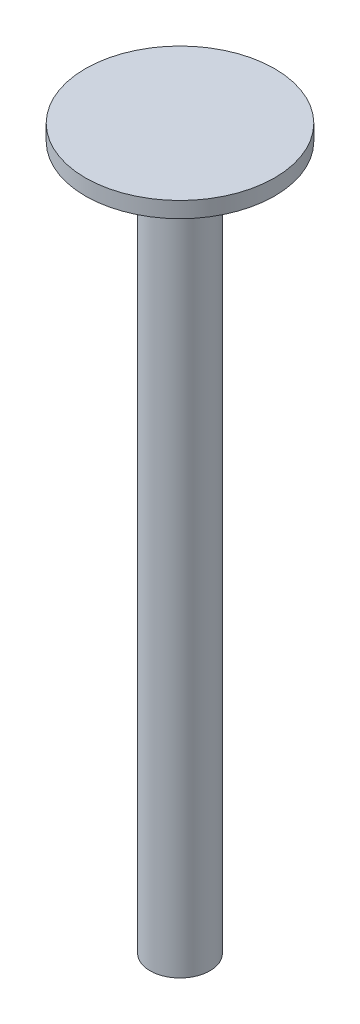
ISO-10303-21;
HEADER;
FILE_DESCRIPTION(('STEP AP214'),'2;1');
FILE_NAME('part.step','',(''),(''),'','','');
FILE_SCHEMA(('AUTOMOTIVE_DESIGN { 1 0 10303 214 1 1 1 1 }'));
ENDSEC;
DATA;
#1=APPLICATION_CONTEXT('core data for automotive mechanical design processes');
#2=APPLICATION_PROTOCOL_DEFINITION('international standard','automotive_design',2000,#1);
#3=PRODUCT_CONTEXT('',#1,'mechanical');
#4=PRODUCT('Part','Part','',(#3));
#5=PRODUCT_RELATED_PRODUCT_CATEGORY('part','',(#4));
#6=PRODUCT_DEFINITION_FORMATION('','',#4);
#7=PRODUCT_DEFINITION_CONTEXT('part definition',#1,'design');
#8=PRODUCT_DEFINITION('design','',#6,#7);
#9=PRODUCT_DEFINITION_SHAPE('','',#8);
#10=(LENGTH_UNIT() NAMED_UNIT(*) SI_UNIT(.MILLI.,.METRE.));
#11=(NAMED_UNIT(*) PLANE_ANGLE_UNIT() SI_UNIT($,.RADIAN.));
#12=(NAMED_UNIT(*) SI_UNIT($,.STERADIAN.) SOLID_ANGLE_UNIT());
#13=UNCERTAINTY_MEASURE_WITH_UNIT(LENGTH_MEASURE(1.E-05),#10,'distance_accuracy_value','');
#14=(GEOMETRIC_REPRESENTATION_CONTEXT(3) GLOBAL_UNCERTAINTY_ASSIGNED_CONTEXT((#13)) GLOBAL_UNIT_ASSIGNED_CONTEXT((#10,
#11,#12)) REPRESENTATION_CONTEXT('',''));
#15=CARTESIAN_POINT('',(0.,0.,0.));
#16=DIRECTION('',(0.,0.,1.));
#17=DIRECTION('',(1.,0.,0.));
#18=AXIS2_PLACEMENT_3D('',#15,#16,#17);
#19=CARTESIAN_POINT('',(0.,22.3,0.));
#20=DIRECTION('',(0.,-1.,0.));
#21=DIRECTION('',(0.,0.,-1.));
#22=AXIS2_PLACEMENT_3D('',#19,#20,#21);
#23=CYLINDRICAL_SURFACE('',#22,0.95);
#24=CARTESIAN_POINT('',(0.,22.3,0.));
#25=DIRECTION('',(0.,1.,0.));
#26=DIRECTION('',(0.,0.,1.));
#27=AXIS2_PLACEMENT_3D('',#24,#25,#26);
#28=CIRCLE('',#27,0.95);
#29=CARTESIAN_POINT('',(0.,22.3,0.95));
#30=VERTEX_POINT('',#29);
#31=EDGE_CURVE('E10',#30,#30,#28,.T.);
#32=ORIENTED_EDGE('',*,*,#31,.F.);
#33=EDGE_LOOP('',(#32));
#34=FACE_BOUND('',#33,.T.);
#35=CARTESIAN_POINT('',(0.,0.,0.));
#36=DIRECTION('',(0.,1.,0.));
#37=DIRECTION('',(0.,0.,1.));
#38=AXIS2_PLACEMENT_3D('',#35,#36,#37);
#39=CIRCLE('',#38,0.95);
#40=CARTESIAN_POINT('',(0.,0.,0.95));
#41=VERTEX_POINT('',#40);
#42=EDGE_CURVE('E37',#41,#41,#39,.T.);
#43=ORIENTED_EDGE('',*,*,#42,.T.);
#44=EDGE_LOOP('',(#43));
#45=FACE_BOUND('',#44,.T.);
#46=ADVANCED_FACE('F34',(#34,#45),#23,.T.);
#47=CARTESIAN_POINT('',(0.,0.,0.));
#48=DIRECTION('',(0.,1.,0.));
#49=DIRECTION('',(0.,0.,1.));
#50=AXIS2_PLACEMENT_3D('',#47,#48,#49);
#51=PLANE('',#50);
#52=ORIENTED_EDGE('',*,*,#42,.F.);
#53=EDGE_LOOP('',(#52));
#54=FACE_BOUND('',#53,.T.);
#55=ADVANCED_FACE('F61',(#54),#51,.F.);
#56=CARTESIAN_POINT('',(0.,22.8,0.));
#57=DIRECTION('',(0.,-1.,0.));
#58=DIRECTION('',(0.,0.,-1.));
#59=AXIS2_PLACEMENT_3D('',#56,#57,#58);
#60=CYLINDRICAL_SURFACE('',#59,3.);
#61=CARTESIAN_POINT('',(0.,22.8,0.));
#62=DIRECTION('',(0.,1.,0.));
#63=DIRECTION('',(0.,0.,1.));
#64=AXIS2_PLACEMENT_3D('',#61,#62,#63);
#65=CIRCLE('',#64,3.);
#66=CARTESIAN_POINT('',(0.,22.8,3.));
#67=VERTEX_POINT('',#66);
#68=EDGE_CURVE('E47',#67,#67,#65,.T.);
#69=ORIENTED_EDGE('',*,*,#68,.F.);
#70=EDGE_LOOP('',(#69));
#71=FACE_BOUND('',#70,.T.);
#72=CARTESIAN_POINT('',(0.,22.3,0.));
#73=DIRECTION('',(0.,1.,0.));
#74=DIRECTION('',(0.,0.,1.));
#75=AXIS2_PLACEMENT_3D('',#72,#73,#74);
#76=CIRCLE('',#75,3.);
#77=CARTESIAN_POINT('',(0.,22.3,3.));
#78=VERTEX_POINT('',#77);
#79=EDGE_CURVE('E49',#78,#78,#76,.T.);
#80=ORIENTED_EDGE('',*,*,#79,.T.);
#81=EDGE_LOOP('',(#80));
#82=FACE_BOUND('',#81,.T.);
#83=ADVANCED_FACE('F58',(#71,#82),#60,.T.);
#84=CARTESIAN_POINT('',(0.,22.8,0.));
#85=DIRECTION('',(0.,1.,0.));
#86=DIRECTION('',(0.,0.,1.));
#87=AXIS2_PLACEMENT_3D('',#84,#85,#86);
#88=PLANE('',#87);
#89=ORIENTED_EDGE('',*,*,#68,.T.);
#90=EDGE_LOOP('',(#89));
#91=FACE_BOUND('',#90,.T.);
#92=ADVANCED_FACE('F56',(#91),#88,.T.);
#93=CARTESIAN_POINT('',(0.,22.3,0.));
#94=DIRECTION('',(0.,1.,0.));
#95=DIRECTION('',(0.,0.,1.));
#96=AXIS2_PLACEMENT_3D('',#93,#94,#95);
#97=PLANE('',#96);
#98=ORIENTED_EDGE('',*,*,#31,.T.);
#99=EDGE_LOOP('',(#98));
#100=FACE_BOUND('',#99,.T.);
#101=ORIENTED_EDGE('',*,*,#79,.F.);
#102=EDGE_LOOP('',(#101));
#103=FACE_BOUND('',#102,.T.);
#104=ADVANCED_FACE('F65',(#100,#103),#97,.F.);
#105=CLOSED_SHELL('',(#46,#55,#83,#92,#104));
#106=MANIFOLD_SOLID_BREP('B2',#105);
#107=ADVANCED_BREP_SHAPE_REPRESENTATION('',(#18,#106),#14);
#108=SHAPE_DEFINITION_REPRESENTATION(#9,#107);
ENDSEC;
END-ISO-10303-21;
